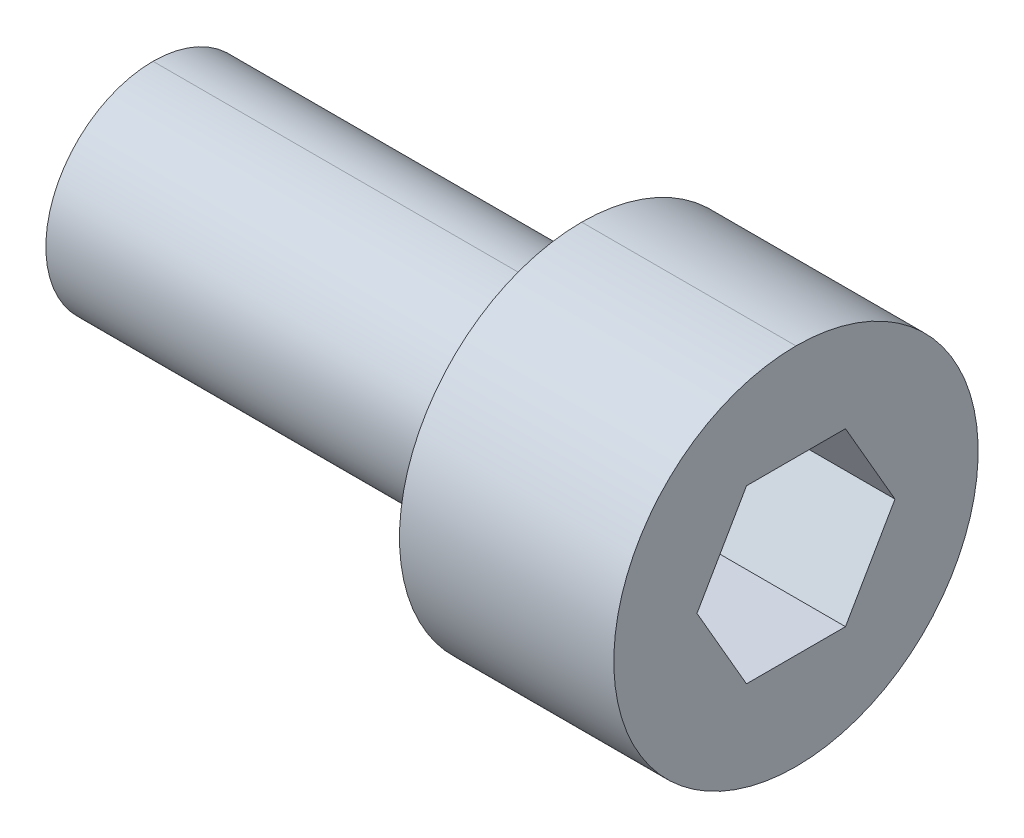
ISO-10303-21;
HEADER;
FILE_DESCRIPTION(('STEP AP214'),'2;1');
FILE_NAME('part.step','',(''),(''),'','','');
FILE_SCHEMA(('AUTOMOTIVE_DESIGN { 1 0 10303 214 1 1 1 1 }'));
ENDSEC;
DATA;
#1=APPLICATION_CONTEXT('core data for automotive mechanical design processes');
#2=APPLICATION_PROTOCOL_DEFINITION('international standard','automotive_design',2000,#1);
#3=PRODUCT_CONTEXT('',#1,'mechanical');
#4=PRODUCT('Part','Part','',(#3));
#5=PRODUCT_RELATED_PRODUCT_CATEGORY('part','',(#4));
#6=PRODUCT_DEFINITION_FORMATION('','',#4);
#7=PRODUCT_DEFINITION_CONTEXT('part definition',#1,'design');
#8=PRODUCT_DEFINITION('design','',#6,#7);
#9=PRODUCT_DEFINITION_SHAPE('','',#8);
#10=(LENGTH_UNIT() NAMED_UNIT(*) SI_UNIT(.MILLI.,.METRE.));
#11=(NAMED_UNIT(*) PLANE_ANGLE_UNIT() SI_UNIT($,.RADIAN.));
#12=(NAMED_UNIT(*) SI_UNIT($,.STERADIAN.) SOLID_ANGLE_UNIT());
#13=UNCERTAINTY_MEASURE_WITH_UNIT(LENGTH_MEASURE(1.E-05),#10,'distance_accuracy_value','');
#14=(GEOMETRIC_REPRESENTATION_CONTEXT(3) GLOBAL_UNCERTAINTY_ASSIGNED_CONTEXT((#13)) GLOBAL_UNIT_ASSIGNED_CONTEXT((#10,
#11,#12)) REPRESENTATION_CONTEXT('',''));
#15=CARTESIAN_POINT('',(0.,0.,0.));
#16=DIRECTION('',(0.,0.,1.));
#17=DIRECTION('',(1.,0.,0.));
#18=AXIS2_PLACEMENT_3D('',#15,#16,#17);
#19=CARTESIAN_POINT('',(2.5,0.,0.));
#20=DIRECTION('',(1.,0.,0.));
#21=DIRECTION('',(0.,1.,0.));
#22=AXIS2_PLACEMENT_3D('',#19,#20,#21);
#23=CYLINDRICAL_SURFACE('',#22,4.25);
#24=DIRECTION('',(1.,0.,0.));
#25=VECTOR('',#24,1.);
#26=CARTESIAN_POINT('',(2.5,4.25,0.));
#27=LINE('',#26,#25);
#28=CARTESIAN_POINT('',(0.,4.25,0.));
#29=VERTEX_POINT('',#28);
#30=CARTESIAN_POINT('',(5.,4.25,0.));
#31=VERTEX_POINT('',#30);
#32=EDGE_CURVE('E10',#29,#31,#27,.T.);
#33=ORIENTED_EDGE('',*,*,#32,.F.);
#34=CARTESIAN_POINT('',(0.,0.,0.));
#35=DIRECTION('',(1.,0.,0.));
#36=DIRECTION('',(0.,1.,0.));
#37=AXIS2_PLACEMENT_3D('',#34,#35,#36);
#38=CIRCLE('',#37,4.25);
#39=CARTESIAN_POINT('',(0.,-4.25,0.));
#40=VERTEX_POINT('',#39);
#41=EDGE_CURVE('E381',#29,#40,#38,.T.);
#42=ORIENTED_EDGE('',*,*,#41,.T.);
#43=DIRECTION('',(1.,0.,0.));
#44=VECTOR('',#43,1.);
#45=CARTESIAN_POINT('',(2.5,-4.25,0.));
#46=LINE('',#45,#44);
#47=CARTESIAN_POINT('',(5.,-4.25,0.));
#48=VERTEX_POINT('',#47);
#49=EDGE_CURVE('E27',#40,#48,#46,.T.);
#50=ORIENTED_EDGE('',*,*,#49,.T.);
#51=CARTESIAN_POINT('',(5.,0.,0.));
#52=DIRECTION('',(1.,0.,0.));
#53=DIRECTION('',(0.,1.,0.));
#54=AXIS2_PLACEMENT_3D('',#51,#52,#53);
#55=CIRCLE('',#54,4.25);
#56=EDGE_CURVE('E139',#31,#48,#55,.T.);
#57=ORIENTED_EDGE('',*,*,#56,.F.);
#58=EDGE_LOOP('',(#33,#42,#50,#57));
#59=FACE_BOUND('',#58,.T.);
#60=ADVANCED_FACE('F16',(#59),#23,.T.);
#61=CARTESIAN_POINT('',(2.5,0.,0.));
#62=DIRECTION('',(1.,0.,0.));
#63=DIRECTION('',(0.,1.,0.));
#64=AXIS2_PLACEMENT_3D('',#61,#62,#63);
#65=CYLINDRICAL_SURFACE('',#64,4.25);
#66=ORIENTED_EDGE('',*,*,#49,.F.);
#67=CARTESIAN_POINT('',(0.,0.,0.));
#68=DIRECTION('',(1.,0.,0.));
#69=DIRECTION('',(0.,1.,0.));
#70=AXIS2_PLACEMENT_3D('',#67,#68,#69);
#71=CIRCLE('',#70,4.25);
#72=EDGE_CURVE('E370',#40,#29,#71,.T.);
#73=ORIENTED_EDGE('',*,*,#72,.T.);
#74=ORIENTED_EDGE('',*,*,#32,.T.);
#75=CARTESIAN_POINT('',(5.,0.,0.));
#76=DIRECTION('',(1.,0.,0.));
#77=DIRECTION('',(0.,1.,0.));
#78=AXIS2_PLACEMENT_3D('',#75,#76,#77);
#79=CIRCLE('',#78,4.25);
#80=EDGE_CURVE('E136',#48,#31,#79,.T.);
#81=ORIENTED_EDGE('',*,*,#80,.F.);
#82=EDGE_LOOP('',(#66,#73,#74,#81));
#83=FACE_BOUND('',#82,.T.);
#84=ADVANCED_FACE('F163',(#83),#65,.T.);
#85=CARTESIAN_POINT('',(5.,0.,0.));
#86=DIRECTION('',(1.,0.,0.));
#87=DIRECTION('',(0.,1.,0.));
#88=AXIS2_PLACEMENT_3D('',#85,#86,#87);
#89=PLANE('',#88);
#90=DIRECTION('',(0.,0.866025403784329,-0.50000000000019));
#91=VECTOR('',#90,1.);
#92=CARTESIAN_POINT('',(5.,-1.,-1.73205080757));
#93=LINE('',#92,#91);
#94=CARTESIAN_POINT('',(5.,-2.,-1.15470053838));
#95=VERTEX_POINT('',#94);
#96=CARTESIAN_POINT('',(5.,0.,-2.30940107676));
#97=VERTEX_POINT('',#96);
#98=EDGE_CURVE('E362',#95,#97,#93,.T.);
#99=ORIENTED_EDGE('',*,*,#98,.F.);
#100=DIRECTION('',(0.,0.,-1.));
#101=VECTOR('',#100,1.);
#102=CARTESIAN_POINT('',(5.,-2.,0.));
#103=LINE('',#102,#101);
#104=CARTESIAN_POINT('',(5.,-2.,1.15470053838));
#105=VERTEX_POINT('',#104);
#106=EDGE_CURVE('E145',#105,#95,#103,.T.);
#107=ORIENTED_EDGE('',*,*,#106,.F.);
#108=DIRECTION('',(0.,-0.866025403784329,-0.50000000000019));
#109=VECTOR('',#108,1.);
#110=CARTESIAN_POINT('',(5.,-1.,1.73205080757));
#111=LINE('',#110,#109);
#112=CARTESIAN_POINT('',(5.,0.,2.30940107676));
#113=VERTEX_POINT('',#112);
#114=EDGE_CURVE('E134',#113,#105,#111,.T.);
#115=ORIENTED_EDGE('',*,*,#114,.F.);
#116=DIRECTION('',(0.,-0.866025403784329,0.50000000000019));
#117=VECTOR('',#116,1.);
#118=CARTESIAN_POINT('',(5.,1.,1.73205080757));
#119=LINE('',#118,#117);
#120=CARTESIAN_POINT('',(5.,2.,1.15470053838));
#121=VERTEX_POINT('',#120);
#122=EDGE_CURVE('E104',#121,#113,#119,.T.);
#123=ORIENTED_EDGE('',*,*,#122,.F.);
#124=DIRECTION('',(0.,0.,1.));
#125=VECTOR('',#124,1.);
#126=CARTESIAN_POINT('',(5.,2.,0.));
#127=LINE('',#126,#125);
#128=CARTESIAN_POINT('',(5.,2.,-1.15470053838));
#129=VERTEX_POINT('',#128);
#130=EDGE_CURVE('E99',#129,#121,#127,.T.);
#131=ORIENTED_EDGE('',*,*,#130,.F.);
#132=DIRECTION('',(0.,0.866025403784329,0.50000000000019));
#133=VECTOR('',#132,1.);
#134=CARTESIAN_POINT('',(5.,1.,-1.73205080757));
#135=LINE('',#134,#133);
#136=EDGE_CURVE('E344',#97,#129,#135,.T.);
#137=ORIENTED_EDGE('',*,*,#136,.F.);
#138=EDGE_LOOP('',(#99,#107,#115,#123,#131,#137));
#139=FACE_BOUND('',#138,.T.);
#140=ORIENTED_EDGE('',*,*,#56,.T.);
#141=ORIENTED_EDGE('',*,*,#80,.T.);
#142=EDGE_LOOP('',(#140,#141));
#143=FACE_BOUND('',#142,.T.);
#144=ADVANCED_FACE('F173',(#139,#143),#89,.T.);
#145=CARTESIAN_POINT('',(5.,2.,-1.15470053838));
#146=DIRECTION('',(0.,-1.,0.));
#147=DIRECTION('',(0.,0.,-1.));
#148=AXIS2_PLACEMENT_3D('',#145,#146,#147);
#149=PLANE('',#148);
#150=DIRECTION('',(-1.,0.,0.));
#151=VECTOR('',#150,1.);
#152=CARTESIAN_POINT('',(3.,2.,-1.15470053838));
#153=LINE('',#152,#151);
#154=CARTESIAN_POINT('',(1.,2.,-1.15470053838));
#155=VERTEX_POINT('',#154);
#156=EDGE_CURVE('E348',#129,#155,#153,.T.);
#157=ORIENTED_EDGE('',*,*,#156,.F.);
#158=ORIENTED_EDGE('',*,*,#130,.T.);
#159=DIRECTION('',(-1.,0.,0.));
#160=VECTOR('',#159,1.);
#161=CARTESIAN_POINT('',(3.,2.,1.15470053838));
#162=LINE('',#161,#160);
#163=CARTESIAN_POINT('',(1.,2.,1.15470053838));
#164=VERTEX_POINT('',#163);
#165=EDGE_CURVE('E92',#121,#164,#162,.T.);
#166=ORIENTED_EDGE('',*,*,#165,.T.);
#167=DIRECTION('',(0.,0.,1.));
#168=VECTOR('',#167,1.);
#169=CARTESIAN_POINT('',(1.,2.,0.));
#170=LINE('',#169,#168);
#171=EDGE_CURVE('E97',#155,#164,#170,.T.);
#172=ORIENTED_EDGE('',*,*,#171,.F.);
#173=EDGE_LOOP('',(#157,#158,#166,#172));
#174=FACE_BOUND('',#173,.T.);
#175=ADVANCED_FACE('F95',(#174),#149,.T.);
#176=CARTESIAN_POINT('',(5.,0.,-2.30940107676));
#177=DIRECTION('',(0.,-0.50000000000019,0.866025403784329));
#178=DIRECTION('',(-1.,0.,0.));
#179=AXIS2_PLACEMENT_3D('',#176,#177,#178);
#180=PLANE('',#179);
#181=DIRECTION('',(-1.,0.,0.));
#182=VECTOR('',#181,1.);
#183=CARTESIAN_POINT('',(3.,0.,-2.30940107676));
#184=LINE('',#183,#182);
#185=CARTESIAN_POINT('',(1.,0.,-2.30940107676));
#186=VERTEX_POINT('',#185);
#187=EDGE_CURVE('E130',#97,#186,#184,.T.);
#188=ORIENTED_EDGE('',*,*,#187,.F.);
#189=ORIENTED_EDGE('',*,*,#136,.T.);
#190=ORIENTED_EDGE('',*,*,#156,.T.);
#191=DIRECTION('',(0.,0.866025403784329,0.50000000000019));
#192=VECTOR('',#191,1.);
#193=CARTESIAN_POINT('',(1.,1.,-1.73205080757));
#194=LINE('',#193,#192);
#195=EDGE_CURVE('E105',#186,#155,#194,.T.);
#196=ORIENTED_EDGE('',*,*,#195,.F.);
#197=EDGE_LOOP('',(#188,#189,#190,#196));
#198=FACE_BOUND('',#197,.T.);
#199=ADVANCED_FACE('F214',(#198),#180,.T.);
#200=CARTESIAN_POINT('',(5.,2.,1.15470053838));
#201=DIRECTION('',(0.,-0.50000000000019,-0.866025403784329));
#202=DIRECTION('',(0.,-0.866025403784329,0.50000000000019));
#203=AXIS2_PLACEMENT_3D('',#200,#201,#202);
#204=PLANE('',#203);
#205=ORIENTED_EDGE('',*,*,#165,.F.);
#206=ORIENTED_EDGE('',*,*,#122,.T.);
#207=DIRECTION('',(-1.,0.,0.));
#208=VECTOR('',#207,1.);
#209=CARTESIAN_POINT('',(3.,0.,2.30940107676));
#210=LINE('',#209,#208);
#211=CARTESIAN_POINT('',(1.,0.,2.30940107676));
#212=VERTEX_POINT('',#211);
#213=EDGE_CURVE('E113',#113,#212,#210,.T.);
#214=ORIENTED_EDGE('',*,*,#213,.T.);
#215=DIRECTION('',(0.,-0.866025403784329,0.50000000000019));
#216=VECTOR('',#215,1.);
#217=CARTESIAN_POINT('',(1.,1.,1.73205080757));
#218=LINE('',#217,#216);
#219=EDGE_CURVE('E109',#164,#212,#218,.T.);
#220=ORIENTED_EDGE('',*,*,#219,.F.);
#221=EDGE_LOOP('',(#205,#206,#214,#220));
#222=FACE_BOUND('',#221,.T.);
#223=ADVANCED_FACE('F110',(#222),#204,.T.);
#224=CARTESIAN_POINT('',(1.,0.,0.));
#225=DIRECTION('',(1.,0.,0.));
#226=DIRECTION('',(0.,1.,0.));
#227=AXIS2_PLACEMENT_3D('',#224,#225,#226);
#228=PLANE('',#227);
#229=ORIENTED_EDGE('',*,*,#171,.T.);
#230=ORIENTED_EDGE('',*,*,#219,.T.);
#231=DIRECTION('',(0.,-0.866025403784329,-0.50000000000019));
#232=VECTOR('',#231,1.);
#233=CARTESIAN_POINT('',(1.,-1.,1.73205080757));
#234=LINE('',#233,#232);
#235=CARTESIAN_POINT('',(1.,-2.,1.15470053838));
#236=VERTEX_POINT('',#235);
#237=EDGE_CURVE('E364',#212,#236,#234,.T.);
#238=ORIENTED_EDGE('',*,*,#237,.T.);
#239=DIRECTION('',(0.,0.,-1.));
#240=VECTOR('',#239,1.);
#241=CARTESIAN_POINT('',(1.,-2.,0.));
#242=LINE('',#241,#240);
#243=CARTESIAN_POINT('',(1.,-2.,-1.15470053838));
#244=VERTEX_POINT('',#243);
#245=EDGE_CURVE('E144',#236,#244,#242,.T.);
#246=ORIENTED_EDGE('',*,*,#245,.T.);
#247=DIRECTION('',(0.,0.866025403784329,-0.50000000000019));
#248=VECTOR('',#247,1.);
#249=CARTESIAN_POINT('',(1.,-1.,-1.73205080757));
#250=LINE('',#249,#248);
#251=EDGE_CURVE('E124',#244,#186,#250,.T.);
#252=ORIENTED_EDGE('',*,*,#251,.T.);
#253=ORIENTED_EDGE('',*,*,#195,.T.);
#254=EDGE_LOOP('',(#229,#230,#238,#246,#252,#253));
#255=FACE_BOUND('',#254,.T.);
#256=ADVANCED_FACE('F120',(#255),#228,.T.);
#257=CARTESIAN_POINT('',(5.,-2.,-1.15470053838));
#258=DIRECTION('',(0.,0.50000000000019,0.866025403784329));
#259=DIRECTION('',(1.,0.,0.));
#260=AXIS2_PLACEMENT_3D('',#257,#258,#259);
#261=PLANE('',#260);
#262=DIRECTION('',(-1.,0.,0.));
#263=VECTOR('',#262,1.);
#264=CARTESIAN_POINT('',(3.,-2.,-1.15470053838));
#265=LINE('',#264,#263);
#266=EDGE_CURVE('E140',#95,#244,#265,.T.);
#267=ORIENTED_EDGE('',*,*,#266,.F.);
#268=ORIENTED_EDGE('',*,*,#98,.T.);
#269=ORIENTED_EDGE('',*,*,#187,.T.);
#270=ORIENTED_EDGE('',*,*,#251,.F.);
#271=EDGE_LOOP('',(#267,#268,#269,#270));
#272=FACE_BOUND('',#271,.T.);
#273=ADVANCED_FACE('F18',(#272),#261,.T.);
#274=CARTESIAN_POINT('',(5.,0.,2.30940107676));
#275=DIRECTION('',(0.,0.50000000000019,-0.866025403784329));
#276=DIRECTION('',(-1.,0.,0.));
#277=AXIS2_PLACEMENT_3D('',#274,#275,#276);
#278=PLANE('',#277);
#279=ORIENTED_EDGE('',*,*,#213,.F.);
#280=ORIENTED_EDGE('',*,*,#114,.T.);
#281=DIRECTION('',(-1.,0.,0.));
#282=VECTOR('',#281,1.);
#283=CARTESIAN_POINT('',(3.,-2.,1.15470053838));
#284=LINE('',#283,#282);
#285=EDGE_CURVE('E383',#105,#236,#284,.T.);
#286=ORIENTED_EDGE('',*,*,#285,.T.);
#287=ORIENTED_EDGE('',*,*,#237,.F.);
#288=EDGE_LOOP('',(#279,#280,#286,#287));
#289=FACE_BOUND('',#288,.T.);
#290=ADVANCED_FACE('F239',(#289),#278,.T.);
#291=CARTESIAN_POINT('',(5.,-2.,1.15470053838));
#292=DIRECTION('',(0.,1.,0.));
#293=DIRECTION('',(1.,0.,0.));
#294=AXIS2_PLACEMENT_3D('',#291,#292,#293);
#295=PLANE('',#294);
#296=ORIENTED_EDGE('',*,*,#285,.F.);
#297=ORIENTED_EDGE('',*,*,#106,.T.);
#298=ORIENTED_EDGE('',*,*,#266,.T.);
#299=ORIENTED_EDGE('',*,*,#245,.F.);
#300=EDGE_LOOP('',(#296,#297,#298,#299));
#301=FACE_BOUND('',#300,.T.);
#302=ADVANCED_FACE('F230',(#301),#295,.T.);
#303=CARTESIAN_POINT('',(0.,0.,0.));
#304=DIRECTION('',(1.,0.,0.));
#305=DIRECTION('',(0.,1.,0.));
#306=AXIS2_PLACEMENT_3D('',#303,#304,#305);
#307=PLANE('',#306);
#308=CARTESIAN_POINT('',(0.,0.,0.));
#309=DIRECTION('',(-1.,0.,0.));
#310=DIRECTION('',(0.,-1.,0.));
#311=AXIS2_PLACEMENT_3D('',#308,#309,#310);
#312=CIRCLE('',#311,2.5);
#313=CARTESIAN_POINT('',(0.,2.5,0.));
#314=VERTEX_POINT('',#313);
#315=CARTESIAN_POINT('',(0.,-2.5,0.));
#316=VERTEX_POINT('',#315);
#317=EDGE_CURVE('E371',#314,#316,#312,.T.);
#318=ORIENTED_EDGE('',*,*,#317,.F.);
#319=CARTESIAN_POINT('',(0.,0.,0.));
#320=DIRECTION('',(-1.,0.,0.));
#321=DIRECTION('',(0.,-1.,0.));
#322=AXIS2_PLACEMENT_3D('',#319,#320,#321);
#323=CIRCLE('',#322,2.5);
#324=EDGE_CURVE('E157',#316,#314,#323,.T.);
#325=ORIENTED_EDGE('',*,*,#324,.F.);
#326=EDGE_LOOP('',(#318,#325));
#327=FACE_BOUND('',#326,.T.);
#328=ORIENTED_EDGE('',*,*,#72,.F.);
#329=ORIENTED_EDGE('',*,*,#41,.F.);
#330=EDGE_LOOP('',(#328,#329));
#331=FACE_BOUND('',#330,.T.);
#332=ADVANCED_FACE('F192',(#327,#331),#307,.F.);
#333=CARTESIAN_POINT('',(-10.,0.,0.));
#334=DIRECTION('',(-1.,0.,0.));
#335=DIRECTION('',(0.,0.,1.));
#336=AXIS2_PLACEMENT_3D('',#333,#334,#335);
#337=PLANE('',#336);
#338=CARTESIAN_POINT('',(-10.,0.,0.));
#339=DIRECTION('',(-1.,0.,0.));
#340=DIRECTION('',(0.,-1.,0.));
#341=AXIS2_PLACEMENT_3D('',#338,#339,#340);
#342=CIRCLE('',#341,2.5);
#343=CARTESIAN_POINT('',(-10.,-2.5,0.));
#344=VERTEX_POINT('',#343);
#345=CARTESIAN_POINT('',(-10.,2.5,0.));
#346=VERTEX_POINT('',#345);
#347=EDGE_CURVE('E384',#344,#346,#342,.T.);
#348=ORIENTED_EDGE('',*,*,#347,.T.);
#349=CARTESIAN_POINT('',(-10.,0.,0.));
#350=DIRECTION('',(-1.,0.,0.));
#351=DIRECTION('',(0.,-1.,0.));
#352=AXIS2_PLACEMENT_3D('',#349,#350,#351);
#353=CIRCLE('',#352,2.5);
#354=EDGE_CURVE('E368',#346,#344,#353,.T.);
#355=ORIENTED_EDGE('',*,*,#354,.T.);
#356=EDGE_LOOP('',(#348,#355));
#357=FACE_BOUND('',#356,.T.);
#358=ADVANCED_FACE('F186',(#357),#337,.T.);
#359=CARTESIAN_POINT('',(-5.,0.,0.));
#360=DIRECTION('',(-1.,0.,0.));
#361=DIRECTION('',(0.,-1.,0.));
#362=AXIS2_PLACEMENT_3D('',#359,#360,#361);
#363=CYLINDRICAL_SURFACE('',#362,2.5);
#364=DIRECTION('',(-1.,0.,0.));
#365=VECTOR('',#364,1.);
#366=CARTESIAN_POINT('',(-5.,2.5,0.));
#367=LINE('',#366,#365);
#368=EDGE_CURVE('E378',#314,#346,#367,.T.);
#369=ORIENTED_EDGE('',*,*,#368,.F.);
#370=ORIENTED_EDGE('',*,*,#317,.T.);
#371=DIRECTION('',(-1.,0.,0.));
#372=VECTOR('',#371,1.);
#373=CARTESIAN_POINT('',(-5.,-2.5,0.));
#374=LINE('',#373,#372);
#375=EDGE_CURVE('E20',#316,#344,#374,.T.);
#376=ORIENTED_EDGE('',*,*,#375,.T.);
#377=ORIENTED_EDGE('',*,*,#354,.F.);
#378=EDGE_LOOP('',(#369,#370,#376,#377));
#379=FACE_BOUND('',#378,.T.);
#380=ADVANCED_FACE('F191',(#379),#363,.T.);
#381=CARTESIAN_POINT('',(-5.,0.,0.));
#382=DIRECTION('',(-1.,0.,0.));
#383=DIRECTION('',(0.,-1.,0.));
#384=AXIS2_PLACEMENT_3D('',#381,#382,#383);
#385=CYLINDRICAL_SURFACE('',#384,2.5);
#386=ORIENTED_EDGE('',*,*,#375,.F.);
#387=ORIENTED_EDGE('',*,*,#324,.T.);
#388=ORIENTED_EDGE('',*,*,#368,.T.);
#389=ORIENTED_EDGE('',*,*,#347,.F.);
#390=EDGE_LOOP('',(#386,#387,#388,#389));
#391=FACE_BOUND('',#390,.T.);
#392=ADVANCED_FACE('F205',(#391),#385,.T.);
#393=CLOSED_SHELL('',(#60,#84,#144,#175,#199,#223,#256,#273,#290,#302,#332,#358,#380,#392));
#394=MANIFOLD_SOLID_BREP('B1',#393);
#395=ADVANCED_BREP_SHAPE_REPRESENTATION('',(#18,#394),#14);
#396=SHAPE_DEFINITION_REPRESENTATION(#9,#395);
ENDSEC;
END-ISO-10303-21;
